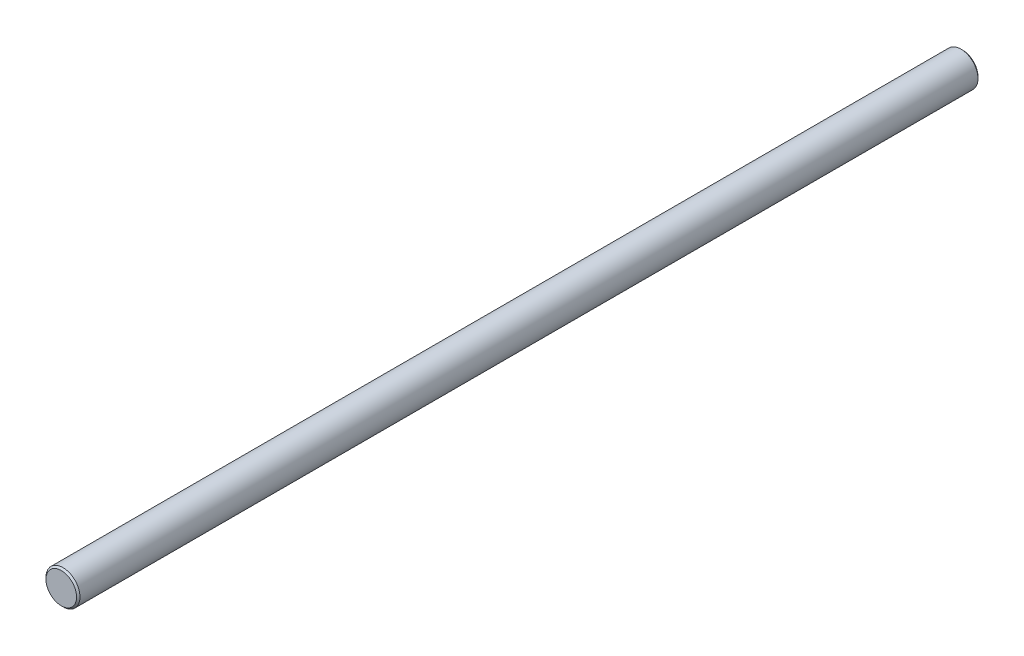
ISO-10303-21;
HEADER;
FILE_DESCRIPTION(('STEP AP214'),'2;1');
FILE_NAME('part.step','',(''),(''),'','','');
FILE_SCHEMA(('AUTOMOTIVE_DESIGN { 1 0 10303 214 1 1 1 1 }'));
ENDSEC;
DATA;
#1=APPLICATION_CONTEXT('core data for automotive mechanical design processes');
#2=APPLICATION_PROTOCOL_DEFINITION('international standard','automotive_design',2000,#1);
#3=PRODUCT_CONTEXT('',#1,'mechanical');
#4=PRODUCT('Part','Part','',(#3));
#5=PRODUCT_RELATED_PRODUCT_CATEGORY('part','',(#4));
#6=PRODUCT_DEFINITION_FORMATION('','',#4);
#7=PRODUCT_DEFINITION_CONTEXT('part definition',#1,'design');
#8=PRODUCT_DEFINITION('design','',#6,#7);
#9=PRODUCT_DEFINITION_SHAPE('','',#8);
#10=(LENGTH_UNIT() NAMED_UNIT(*) SI_UNIT(.MILLI.,.METRE.));
#11=(NAMED_UNIT(*) PLANE_ANGLE_UNIT() SI_UNIT($,.RADIAN.));
#12=(NAMED_UNIT(*) SI_UNIT($,.STERADIAN.) SOLID_ANGLE_UNIT());
#13=UNCERTAINTY_MEASURE_WITH_UNIT(LENGTH_MEASURE(1.E-05),#10,'distance_accuracy_value','');
#14=(GEOMETRIC_REPRESENTATION_CONTEXT(3) GLOBAL_UNCERTAINTY_ASSIGNED_CONTEXT((#13)) GLOBAL_UNIT_ASSIGNED_CONTEXT((#10,
#11,#12)) REPRESENTATION_CONTEXT('',''));
#15=CARTESIAN_POINT('',(0.,0.,0.));
#16=DIRECTION('',(0.,0.,1.));
#17=DIRECTION('',(1.,0.,0.));
#18=AXIS2_PLACEMENT_3D('',#15,#16,#17);
#19=CARTESIAN_POINT('',(0.,0.,53.));
#20=DIRECTION('',(0.,0.,-1.));
#21=DIRECTION('',(-1.,0.,0.));
#22=AXIS2_PLACEMENT_3D('',#19,#20,#21);
#23=CYLINDRICAL_SURFACE('',#22,1.);
#24=CARTESIAN_POINT('',(0.,0.,0.099999999999989));
#25=DIRECTION('',(0.,0.,1.));
#26=DIRECTION('',(1.,0.,0.));
#27=AXIS2_PLACEMENT_3D('',#24,#25,#26);
#28=CIRCLE('',#27,1.);
#29=CARTESIAN_POINT('',(1.,0.,0.099999999999989));
#30=VERTEX_POINT('',#29);
#31=EDGE_CURVE('E41',#30,#30,#28,.T.);
#32=ORIENTED_EDGE('',*,*,#31,.T.);
#33=EDGE_LOOP('',(#32));
#34=FACE_BOUND('',#33,.T.);
#35=CARTESIAN_POINT('',(0.,0.,52.9));
#36=DIRECTION('',(0.,0.,1.));
#37=DIRECTION('',(1.,0.,0.));
#38=AXIS2_PLACEMENT_3D('',#35,#36,#37);
#39=CIRCLE('',#38,1.);
#40=CARTESIAN_POINT('',(1.,0.,52.9));
#41=VERTEX_POINT('',#40);
#42=EDGE_CURVE('E45',#41,#41,#39,.F.);
#43=ORIENTED_EDGE('',*,*,#42,.T.);
#44=EDGE_LOOP('',(#43));
#45=FACE_BOUND('',#44,.T.);
#46=ADVANCED_FACE('F30',(#34,#45),#23,.T.);
#47=CARTESIAN_POINT('',(0.,0.,53.));
#48=DIRECTION('',(0.,0.,1.));
#49=DIRECTION('',(1.,0.,0.));
#50=AXIS2_PLACEMENT_3D('',#47,#48,#49);
#51=PLANE('',#50);
#52=CARTESIAN_POINT('',(0.,0.,53.));
#53=DIRECTION('',(0.,0.,1.));
#54=DIRECTION('',(1.,0.,0.));
#55=AXIS2_PLACEMENT_3D('',#52,#53,#54);
#56=CIRCLE('',#55,0.899999999999998);
#57=CARTESIAN_POINT('',(0.899999999999998,0.,53.));
#58=VERTEX_POINT('',#57);
#59=EDGE_CURVE('E10',#58,#58,#56,.T.);
#60=ORIENTED_EDGE('',*,*,#59,.T.);
#61=EDGE_LOOP('',(#60));
#62=FACE_BOUND('',#61,.T.);
#63=ADVANCED_FACE('F61',(#62),#51,.T.);
#64=CARTESIAN_POINT('',(0.,0.,0.));
#65=DIRECTION('',(0.,0.,1.));
#66=DIRECTION('',(1.,0.,0.));
#67=AXIS2_PLACEMENT_3D('',#64,#65,#66);
#68=PLANE('',#67);
#69=CARTESIAN_POINT('',(0.,0.,0.));
#70=DIRECTION('',(0.,0.,1.));
#71=DIRECTION('',(1.,0.,0.));
#72=AXIS2_PLACEMENT_3D('',#69,#70,#71);
#73=CIRCLE('',#72,0.900000000000005);
#74=CARTESIAN_POINT('',(0.900000000000005,0.,0.));
#75=VERTEX_POINT('',#74);
#76=EDGE_CURVE('E37',#75,#75,#73,.F.);
#77=ORIENTED_EDGE('',*,*,#76,.T.);
#78=EDGE_LOOP('',(#77));
#79=FACE_BOUND('',#78,.T.);
#80=ADVANCED_FACE('F58',(#79),#68,.F.);
#81=CARTESIAN_POINT('',(0.,0.,0.099999999999989));
#82=DIRECTION('',(0.,0.,1.));
#83=DIRECTION('',(1.,0.,0.));
#84=AXIS2_PLACEMENT_3D('',#81,#82,#83);
#85=CONICAL_SURFACE('',#84,1.,0.785398163397478);
#86=CARTESIAN_POINT('',(0.900000000000005,0.,0.));
#87=CARTESIAN_POINT('',(0.901041666666672,0.,0.00104166666666655));
#88=CARTESIAN_POINT('',(0.902083333333338,0.,0.0020833333333331));
#89=CARTESIAN_POINT('',(0.904166666666671,0.,0.0041666666666662));
#90=CARTESIAN_POINT('',(0.905208333333338,0.,0.00520833333333275));
#91=CARTESIAN_POINT('',(0.907291666666671,0.,0.00729166666666585));
#92=CARTESIAN_POINT('',(0.908333333333338,0.,0.00833333333333239));
#93=CARTESIAN_POINT('',(0.910416666666671,0.,0.0104166666666655));
#94=CARTESIAN_POINT('',(0.911458333333338,0.,0.0114583333333321));
#95=CARTESIAN_POINT('',(0.913541666666671,0.,0.0135416666666652));
#96=CARTESIAN_POINT('',(0.914583333333337,0.,0.0145833333333317));
#97=CARTESIAN_POINT('',(0.916666666666671,0.,0.0166666666666648));
#98=CARTESIAN_POINT('',(0.917708333333337,0.,0.0177083333333314));
#99=CARTESIAN_POINT('',(0.919791666666671,0.,0.0197916666666645));
#100=CARTESIAN_POINT('',(0.920833333333337,0.,0.020833333333331));
#101=CARTESIAN_POINT('',(0.92291666666667,0.,0.0229166666666641));
#102=CARTESIAN_POINT('',(0.923958333333337,0.,0.0239583333333307));
#103=CARTESIAN_POINT('',(0.92604166666667,0.,0.0260416666666638));
#104=CARTESIAN_POINT('',(0.927083333333337,0.,0.0270833333333303));
#105=CARTESIAN_POINT('',(0.92916666666667,0.,0.0291666666666634));
#106=CARTESIAN_POINT('',(0.930208333333337,0.,0.03020833333333));
#107=CARTESIAN_POINT('',(0.93229166666667,0.,0.0322916666666631));
#108=CARTESIAN_POINT('',(0.933333333333337,0.,0.0333333333333297));
#109=CARTESIAN_POINT('',(0.93541666666667,0.,0.0354166666666628));
#110=CARTESIAN_POINT('',(0.936458333333336,0.,0.0364583333333293));
#111=CARTESIAN_POINT('',(0.93854166666667,0.,0.0385416666666624));
#112=CARTESIAN_POINT('',(0.939583333333336,0.,0.0395833333333289));
#113=CARTESIAN_POINT('',(0.941666666666669,0.,0.0416666666666621));
#114=CARTESIAN_POINT('',(0.942708333333336,0.,0.0427083333333286));
#115=CARTESIAN_POINT('',(0.944791666666669,0.,0.0447916666666617));
#116=CARTESIAN_POINT('',(0.945833333333336,0.,0.0458333333333283));
#117=CARTESIAN_POINT('',(0.947916666666669,0.,0.0479166666666614));
#118=CARTESIAN_POINT('',(0.948958333333336,0.,0.0489583333333279));
#119=CARTESIAN_POINT('',(0.951041666666669,0.,0.051041666666661));
#120=CARTESIAN_POINT('',(0.952083333333336,0.,0.0520833333333276));
#121=CARTESIAN_POINT('',(0.954166666666669,0.,0.0541666666666607));
#122=CARTESIAN_POINT('',(0.955208333333335,0.,0.0552083333333272));
#123=CARTESIAN_POINT('',(0.957291666666669,0.,0.0572916666666603));
#124=CARTESIAN_POINT('',(0.958333333333335,0.,0.0583333333333269));
#125=CARTESIAN_POINT('',(0.960416666666669,0.,0.06041666666666));
#126=CARTESIAN_POINT('',(0.961458333333335,0.,0.0614583333333266));
#127=CARTESIAN_POINT('',(0.963541666666668,0.,0.0635416666666597));
#128=CARTESIAN_POINT('',(0.964583333333335,0.,0.0645833333333262));
#129=CARTESIAN_POINT('',(0.966666666666668,0.,0.0666666666666593));
#130=CARTESIAN_POINT('',(0.967708333333335,0.,0.0677083333333259));
#131=CARTESIAN_POINT('',(0.969791666666668,0.,0.069791666666659));
#132=CARTESIAN_POINT('',(0.970833333333335,0.,0.0708333333333255));
#133=CARTESIAN_POINT('',(0.972916666666668,0.,0.0729166666666586));
#134=CARTESIAN_POINT('',(0.973958333333334,0.,0.0739583333333252));
#135=CARTESIAN_POINT('',(0.976041666666668,0.,0.0760416666666583));
#136=CARTESIAN_POINT('',(0.977083333333334,0.,0.0770833333333248));
#137=CARTESIAN_POINT('',(0.979166666666668,0.,0.0791666666666579));
#138=CARTESIAN_POINT('',(0.980208333333334,0.,0.0802083333333245));
#139=CARTESIAN_POINT('',(0.982291666666667,0.,0.0822916666666576));
#140=CARTESIAN_POINT('',(0.983333333333334,0.,0.0833333333333241));
#141=CARTESIAN_POINT('',(0.985416666666667,0.,0.0854166666666572));
#142=CARTESIAN_POINT('',(0.986458333333334,0.,0.0864583333333238));
#143=CARTESIAN_POINT('',(0.988541666666667,0.,0.0885416666666569));
#144=CARTESIAN_POINT('',(0.989583333333334,0.,0.0895833333333235));
#145=CARTESIAN_POINT('',(0.991666666666667,0.,0.0916666666666566));
#146=CARTESIAN_POINT('',(0.992708333333334,0.,0.0927083333333231));
#147=CARTESIAN_POINT('',(0.994791666666667,0.,0.0947916666666562));
#148=CARTESIAN_POINT('',(0.995833333333333,0.,0.0958333333333228));
#149=CARTESIAN_POINT('',(0.997916666666666,0.,0.0979166666666559));
#150=CARTESIAN_POINT('',(0.998958333333333,0.,0.0989583333333224));
#151=CARTESIAN_POINT('',(1.,0.,0.099999999999989));
#152=B_SPLINE_CURVE_WITH_KNOTS('',3,(#86,#87,#88,#89,#90,#91,#92,#93,#94,#95,#96,#97,#98,#99,
#100,#101,#102,#103,#104,#105,#106,#107,#108,#109,#110,#111,#112,#113,#114,#115,#116,#117,#118,
#119,#120,#121,#122,#123,#124,#125,#126,#127,#128,#129,#130,#131,#132,#133,#134,#135,#136,#137,
#138,#139,#140,#141,#142,#143,#144,#145,#146,#147,#148,#149,#150,#151),.UNSPECIFIED.,.F.,.F.,(4,
2,2,2,2,2,2,2,2,2,2,2,2,2,2,2,2,2,2,2,2,2,2,2,2,2,2,2,2,2,2,2,4),(0.,0.00441941738241551,
0.0088388347648311,0.0132582521472467,0.0176776695296622,0.0220970869120778,0.0265165042944934,
0.030935921676909,0.0353553390593245,0.0397747564417401,0.0441941738241557,0.0486135912065712,
0.0530330085889868,0.0574524259714024,0.0618718433538179,0.0662912607362335,0.070710678118649,
0.0751300955010646,0.0795495128834801,0.0839689302658957,0.0883883476483113,0.0928077650307269,
0.0972271824131424,0.101646599795558,0.106066017177974,0.110485434560389,0.114904851942805,
0.11932426932522,0.123743686707636,0.128163104090051,0.132582521472467,0.137001938854882,
0.141421356237298),.UNSPECIFIED.);
#153=EDGE_CURVE('BSEAM54',#75,#30,#152,.T.);
#154=ORIENTED_EDGE('',*,*,#76,.F.);
#155=ORIENTED_EDGE('',*,*,#31,.F.);
#156=ORIENTED_EDGE('',*,*,#153,.T.);
#157=ORIENTED_EDGE('',*,*,#153,.F.);
#158=EDGE_LOOP('',(#154,#156,#155,#157));
#159=FACE_BOUND('',#158,.T.);
#160=ADVANCED_FACE('F54',(#159),#85,.T.);
#161=CARTESIAN_POINT('',(0.,0.,53.));
#162=DIRECTION('',(0.,0.,-1.));
#163=DIRECTION('',(-1.,0.,0.));
#164=AXIS2_PLACEMENT_3D('',#161,#162,#163);
#165=CONICAL_SURFACE('',#164,0.899999999999998,0.785398163397443);
#166=ORIENTED_EDGE('',*,*,#42,.F.);
#167=EDGE_LOOP('',(#166));
#168=FACE_BOUND('',#167,.T.);
#169=ORIENTED_EDGE('',*,*,#59,.F.);
#170=EDGE_LOOP('',(#169));
#171=FACE_BOUND('',#170,.T.);
#172=ADVANCED_FACE('F32',(#168,#171),#165,.T.);
#173=CLOSED_SHELL('',(#46,#63,#80,#160,#172));
#174=MANIFOLD_SOLID_BREP('B2',#173);
#175=ADVANCED_BREP_SHAPE_REPRESENTATION('',(#18,#174),#14);
#176=SHAPE_DEFINITION_REPRESENTATION(#9,#175);
ENDSEC;
END-ISO-10303-21;
